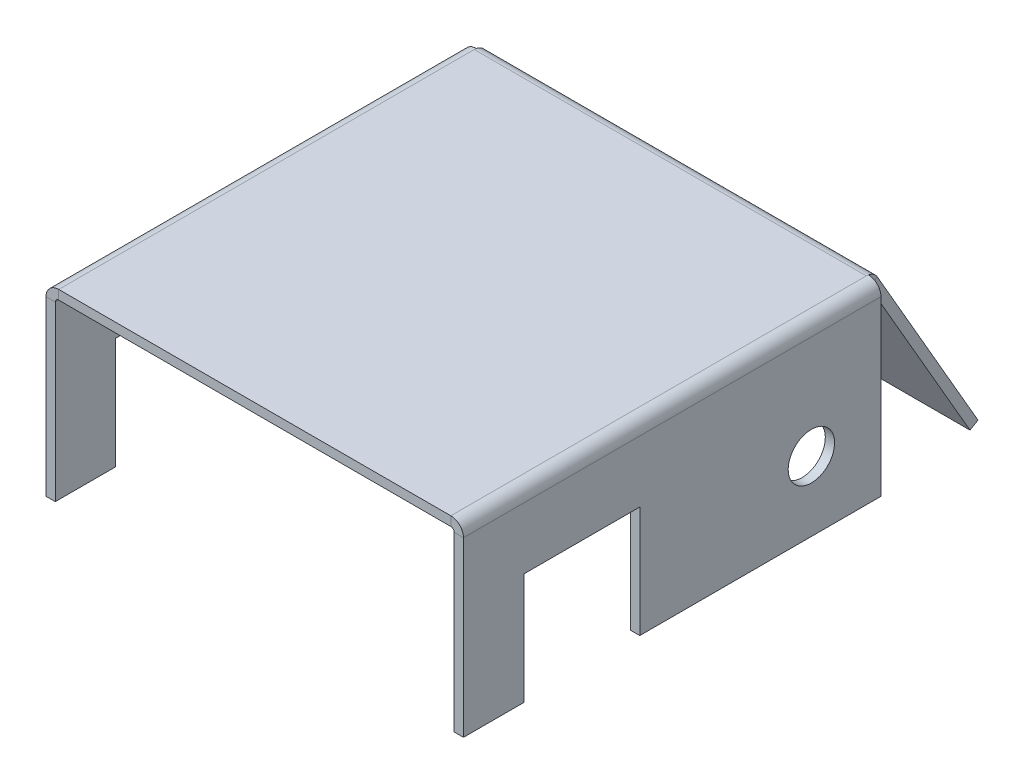
ISO-10303-21;
HEADER;
FILE_DESCRIPTION(('STEP AP214'),'2;1');
FILE_NAME('part.step','',(''),(''),'','','');
FILE_SCHEMA(('AUTOMOTIVE_DESIGN { 1 0 10303 214 1 1 1 1 }'));
ENDSEC;
DATA;
#1=APPLICATION_CONTEXT('core data for automotive mechanical design processes');
#2=APPLICATION_PROTOCOL_DEFINITION('international standard','automotive_design',2000,#1);
#3=PRODUCT_CONTEXT('',#1,'mechanical');
#4=PRODUCT('Part','Part','',(#3));
#5=PRODUCT_RELATED_PRODUCT_CATEGORY('part','',(#4));
#6=PRODUCT_DEFINITION_FORMATION('','',#4);
#7=PRODUCT_DEFINITION_CONTEXT('part definition',#1,'design');
#8=PRODUCT_DEFINITION('design','',#6,#7);
#9=PRODUCT_DEFINITION_SHAPE('','',#8);
#10=(LENGTH_UNIT() NAMED_UNIT(*) SI_UNIT(.MILLI.,.METRE.));
#11=(NAMED_UNIT(*) PLANE_ANGLE_UNIT() SI_UNIT($,.RADIAN.));
#12=(NAMED_UNIT(*) SI_UNIT($,.STERADIAN.) SOLID_ANGLE_UNIT());
#13=UNCERTAINTY_MEASURE_WITH_UNIT(LENGTH_MEASURE(1.E-05),#10,'distance_accuracy_value','');
#14=(GEOMETRIC_REPRESENTATION_CONTEXT(3) GLOBAL_UNCERTAINTY_ASSIGNED_CONTEXT((#13)) GLOBAL_UNIT_ASSIGNED_CONTEXT((#10,
#11,#12)) REPRESENTATION_CONTEXT('',''));
#15=CARTESIAN_POINT('',(0.,0.,0.));
#16=DIRECTION('',(0.,0.,1.));
#17=DIRECTION('',(1.,0.,0.));
#18=AXIS2_PLACEMENT_3D('',#15,#16,#17);
#19=CARTESIAN_POINT('',(-42.319749216301,-40.,46.974921630094));
#20=DIRECTION('',(0.,1.,0.));
#21=DIRECTION('',(-1.,0.,0.));
#22=AXIS2_PLACEMENT_3D('',#19,#20,#21);
#23=PLANE('',#22);
#24=DIRECTION('',(0.,0.,1.));
#25=VECTOR('',#24,1.);
#26=CARTESIAN_POINT('',(-42.319749216301,-40.,0.));
#27=LINE('',#26,#25);
#28=CARTESIAN_POINT('',(-42.319749216301,-40.0000000000003,33.9749216300941));
#29=VERTEX_POINT('',#28);
#30=CARTESIAN_POINT('',(-42.319749216301,-40.,46.974921630094));
#31=VERTEX_POINT('',#30);
#32=EDGE_CURVE('E276',#29,#31,#27,.T.);
#33=ORIENTED_EDGE('',*,*,#32,.F.);
#34=DIRECTION('',(1.,0.,0.));
#35=VECTOR('',#34,1.);
#36=CARTESIAN_POINT('',(-42.319749216301,-40.0000000000003,33.9749216300941));
#37=LINE('',#36,#35);
#38=CARTESIAN_POINT('',(-40.319749216301,-40.0000000000003,33.9749216300941));
#39=VERTEX_POINT('',#38);
#40=EDGE_CURVE('E259',#29,#39,#37,.T.);
#41=ORIENTED_EDGE('',*,*,#40,.T.);
#42=DIRECTION('',(0.,0.,-1.));
#43=VECTOR('',#42,1.);
#44=CARTESIAN_POINT('',(-40.319749216301,-40.,46.974921630094));
#45=LINE('',#44,#43);
#46=CARTESIAN_POINT('',(-40.319749216301,-40.,46.974921630094));
#47=VERTEX_POINT('',#46);
#48=EDGE_CURVE('E299',#39,#47,#45,.F.);
#49=ORIENTED_EDGE('',*,*,#48,.T.);
#50=DIRECTION('',(1.,0.,0.));
#51=VECTOR('',#50,1.);
#52=CARTESIAN_POINT('',(-42.319749216301,-40.,46.974921630094));
#53=LINE('',#52,#51);
#54=EDGE_CURVE('E282',#31,#47,#53,.T.);
#55=ORIENTED_EDGE('',*,*,#54,.F.);
#56=EDGE_LOOP('',(#33,#41,#49,#55));
#57=FACE_BOUND('',#56,.T.);
#58=ADVANCED_FACE('F79',(#57),#23,.F.);
#59=CARTESIAN_POINT('',(47.6802507836992,-40.,-43.0250783699059));
#60=DIRECTION('',(0.,1.,0.));
#61=DIRECTION('',(-1.,0.,0.));
#62=AXIS2_PLACEMENT_3D('',#59,#60,#61);
#63=PLANE('',#62);
#64=DIRECTION('',(0.,0.,1.));
#65=VECTOR('',#64,1.);
#66=CARTESIAN_POINT('',(45.6802507836992,-40.,-43.0250783699059));
#67=LINE('',#66,#65);
#68=CARTESIAN_POINT('',(45.6802507836992,-40.,46.974921630094));
#69=VERTEX_POINT('',#68);
#70=CARTESIAN_POINT('',(45.6802507836992,-40.,33.974921630094));
#71=VERTEX_POINT('',#70);
#72=EDGE_CURVE('E358',#69,#71,#67,.F.);
#73=ORIENTED_EDGE('',*,*,#72,.T.);
#74=DIRECTION('',(1.,0.,0.));
#75=VECTOR('',#74,1.);
#76=CARTESIAN_POINT('',(47.6802507836992,-40.,33.974921630094));
#77=LINE('',#76,#75);
#78=CARTESIAN_POINT('',(47.6802507836992,-40.,33.974921630094));
#79=VERTEX_POINT('',#78);
#80=EDGE_CURVE('E88',#71,#79,#77,.T.);
#81=ORIENTED_EDGE('',*,*,#80,.T.);
#82=DIRECTION('',(0.,0.,-1.));
#83=VECTOR('',#82,1.);
#84=CARTESIAN_POINT('',(47.6802507836992,-40.,0.));
#85=LINE('',#84,#83);
#86=CARTESIAN_POINT('',(47.6802507836992,-40.,46.974921630094));
#87=VERTEX_POINT('',#86);
#88=EDGE_CURVE('E355',#87,#79,#85,.T.);
#89=ORIENTED_EDGE('',*,*,#88,.F.);
#90=DIRECTION('',(-1.,0.,0.));
#91=VECTOR('',#90,1.);
#92=CARTESIAN_POINT('',(47.6802507836992,-40.,46.974921630094));
#93=LINE('',#92,#91);
#94=EDGE_CURVE('E415',#87,#69,#93,.T.);
#95=ORIENTED_EDGE('',*,*,#94,.T.);
#96=EDGE_LOOP('',(#73,#81,#89,#95));
#97=FACE_BOUND('',#96,.T.);
#98=ADVANCED_FACE('F353',(#97),#63,.F.);
#99=CARTESIAN_POINT('',(44.9436507836991,-2.00000000000001,-43.0250783699059));
#100=DIRECTION('',(-1.,0.,0.));
#101=DIRECTION('',(0.,0.,1.));
#102=AXIS2_PLACEMENT_3D('',#99,#100,#101);
#103=PLANE('',#102);
#104=DIRECTION('',(0.,1.,0.));
#105=VECTOR('',#104,1.);
#106=CARTESIAN_POINT('',(44.9436507836991,-2.00000000000001,-43.0250783699059));
#107=LINE('',#106,#105);
#108=CARTESIAN_POINT('',(44.9436507836991,-0.0332465812500848,-43.025078369906));
#109=VERTEX_POINT('',#108);
#110=CARTESIAN_POINT('',(44.9436507836991,0.,-43.0250783699059));
#111=VERTEX_POINT('',#110);
#112=EDGE_CURVE('E418',#109,#111,#107,.T.);
#113=ORIENTED_EDGE('',*,*,#112,.F.);
#114=CARTESIAN_POINT('',(44.9436507836991,-2.7366,-42.5998021616208));
#115=DIRECTION('',(1.,0.,0.));
#116=DIRECTION('',(0.,1.,0.));
#117=AXIS2_PLACEMENT_3D('',#114,#115,#116);
#118=CIRCLE('',#117,2.73660000000005);
#119=CARTESIAN_POINT('',(44.9436507836991,0.,-42.5998021616208));
#120=VERTEX_POINT('',#119);
#121=EDGE_CURVE('E344',#109,#120,#118,.T.);
#122=ORIENTED_EDGE('',*,*,#121,.T.);
#123=DIRECTION('',(0.,0.,1.));
#124=VECTOR('',#123,1.);
#125=CARTESIAN_POINT('',(44.9436507836991,0.,46.974921630094));
#126=LINE('',#125,#124);
#127=EDGE_CURVE('E395',#111,#120,#126,.T.);
#128=ORIENTED_EDGE('',*,*,#127,.F.);
#129=EDGE_LOOP('',(#113,#122,#128));
#130=FACE_BOUND('',#129,.T.);
#131=ADVANCED_FACE('F634',(#130),#103,.T.);
#132=CARTESIAN_POINT('',(-39.5831492163009,-1.99999999999998,-42.5998021616208));
#133=DIRECTION('',(1.,0.,0.));
#134=DIRECTION('',(0.,0.,-1.));
#135=AXIS2_PLACEMENT_3D('',#132,#133,#134);
#136=PLANE('',#135);
#137=DIRECTION('',(0.,0.,-1.));
#138=VECTOR('',#137,1.);
#139=CARTESIAN_POINT('',(-39.5831492163009,0.,-43.0250783699059));
#140=LINE('',#139,#138);
#141=CARTESIAN_POINT('',(-39.5831492163009,0.,-43.0250783699059));
#142=VERTEX_POINT('',#141);
#143=CARTESIAN_POINT('',(-39.5831492163009,0.,-42.5998021616208));
#144=VERTEX_POINT('',#143);
#145=EDGE_CURVE('E313',#142,#144,#140,.F.);
#146=ORIENTED_EDGE('',*,*,#145,.T.);
#147=CARTESIAN_POINT('',(-39.5831492163009,-2.73660000000003,-42.5998021616208));
#148=DIRECTION('',(1.,0.,0.));
#149=DIRECTION('',(0.,1.,0.));
#150=AXIS2_PLACEMENT_3D('',#147,#148,#149);
#151=CIRCLE('',#150,2.73660000000005);
#152=CARTESIAN_POINT('',(-39.5831492163009,-0.0332465812501043,-43.0250783699059));
#153=VERTEX_POINT('',#152);
#154=EDGE_CURVE('E475',#144,#153,#151,.F.);
#155=ORIENTED_EDGE('',*,*,#154,.T.);
#156=DIRECTION('',(0.,1.,0.));
#157=VECTOR('',#156,1.);
#158=CARTESIAN_POINT('',(-39.5831492163009,-2.00000000000001,-43.0250783699059));
#159=LINE('',#158,#157);
#160=EDGE_CURVE('E319',#153,#142,#159,.T.);
#161=ORIENTED_EDGE('',*,*,#160,.T.);
#162=EDGE_LOOP('',(#146,#155,#161));
#163=FACE_BOUND('',#162,.T.);
#164=ADVANCED_FACE('F673',(#163),#136,.T.);
#165=CARTESIAN_POINT('',(0.,-2.,0.));
#166=DIRECTION('',(0.,-1.,0.));
#167=DIRECTION('',(0.,0.,-1.));
#168=AXIS2_PLACEMENT_3D('',#165,#166,#167);
#169=PLANE('',#168);
#170=DIRECTION('',(0.,0.,-1.));
#171=VECTOR('',#170,1.);
#172=CARTESIAN_POINT('',(-39.5831492163009,-2.00000000000001,-43.0250783699059));
#173=LINE('',#172,#171);
#174=CARTESIAN_POINT('',(-39.5831492163009,-1.99999999999998,-42.5998021616208));
#175=VERTEX_POINT('',#174);
#176=CARTESIAN_POINT('',(-39.5831492163009,-2.,46.9749216300941));
#177=VERTEX_POINT('',#176);
#178=EDGE_CURVE('E329',#175,#177,#173,.F.);
#179=ORIENTED_EDGE('',*,*,#178,.F.);
#180=DIRECTION('',(1.,0.,0.));
#181=VECTOR('',#180,1.);
#182=CARTESIAN_POINT('',(44.9436507836991,-1.99999999999996,-42.5998021616208));
#183=LINE('',#182,#181);
#184=CARTESIAN_POINT('',(44.9436507836991,-1.99999999999996,-42.5998021616208));
#185=VERTEX_POINT('',#184);
#186=EDGE_CURVE('E460',#185,#175,#183,.F.);
#187=ORIENTED_EDGE('',*,*,#186,.F.);
#188=DIRECTION('',(0.,0.,1.));
#189=VECTOR('',#188,1.);
#190=CARTESIAN_POINT('',(44.9436507836991,-2.00000000000001,46.974921630094));
#191=LINE('',#190,#189);
#192=CARTESIAN_POINT('',(44.9436507836991,-2.00000000000001,46.974921630094));
#193=VERTEX_POINT('',#192);
#194=EDGE_CURVE('E409',#193,#185,#191,.F.);
#195=ORIENTED_EDGE('',*,*,#194,.F.);
#196=DIRECTION('',(1.,0.,0.));
#197=VECTOR('',#196,1.);
#198=CARTESIAN_POINT('',(47.6802507836991,-2.,46.9749216300941));
#199=LINE('',#198,#197);
#200=EDGE_CURVE('E341',#177,#193,#199,.T.);
#201=ORIENTED_EDGE('',*,*,#200,.F.);
#202=EDGE_LOOP('',(#179,#187,#195,#201));
#203=FACE_BOUND('',#202,.T.);
#204=ADVANCED_FACE('F575',(#203),#169,.T.);
#205=CARTESIAN_POINT('',(0.,0.,0.));
#206=DIRECTION('',(0.,-1.,0.));
#207=DIRECTION('',(0.,0.,-1.));
#208=AXIS2_PLACEMENT_3D('',#205,#206,#207);
#209=PLANE('',#208);
#210=DIRECTION('',(1.,0.,0.));
#211=VECTOR('',#210,1.);
#212=CARTESIAN_POINT('',(44.9436507836991,0.,-42.5998021616208));
#213=LINE('',#212,#211);
#214=EDGE_CURVE('E463',#120,#144,#213,.F.);
#215=ORIENTED_EDGE('',*,*,#214,.T.);
#216=CARTESIAN_POINT('',(-39.5831492163009,0.,46.9749216300941));
#217=VERTEX_POINT('',#216);
#218=EDGE_CURVE('E316',#144,#217,#140,.F.);
#219=ORIENTED_EDGE('',*,*,#218,.T.);
#220=DIRECTION('',(1.,0.,0.));
#221=VECTOR('',#220,1.);
#222=CARTESIAN_POINT('',(47.6802507836991,0.,46.9749216300941));
#223=LINE('',#222,#221);
#224=CARTESIAN_POINT('',(44.9436507836991,0.,46.974921630094));
#225=VERTEX_POINT('',#224);
#226=EDGE_CURVE('E337',#217,#225,#223,.T.);
#227=ORIENTED_EDGE('',*,*,#226,.T.);
#228=DIRECTION('',(0.,0.,1.));
#229=VECTOR('',#228,1.);
#230=CARTESIAN_POINT('',(44.9436507836991,0.,46.974921630094));
#231=LINE('',#230,#229);
#232=EDGE_CURVE('E396',#225,#120,#231,.F.);
#233=ORIENTED_EDGE('',*,*,#232,.T.);
#234=EDGE_LOOP('',(#215,#219,#227,#233));
#235=FACE_BOUND('',#234,.T.);
#236=ADVANCED_FACE('F672',(#235),#209,.F.);
#237=CARTESIAN_POINT('',(47.6802507836991,-2.,46.9749216300941));
#238=DIRECTION('',(0.,0.,1.));
#239=DIRECTION('',(1.,0.,0.));
#240=AXIS2_PLACEMENT_3D('',#237,#238,#239);
#241=PLANE('',#240);
#242=ORIENTED_EDGE('',*,*,#200,.T.);
#243=DIRECTION('',(0.,1.,0.));
#244=VECTOR('',#243,1.);
#245=CARTESIAN_POINT('',(44.9436507836991,-2.00000000000001,46.974921630094));
#246=LINE('',#245,#244);
#247=EDGE_CURVE('E403',#193,#225,#246,.T.);
#248=ORIENTED_EDGE('',*,*,#247,.T.);
#249=ORIENTED_EDGE('',*,*,#226,.F.);
#250=DIRECTION('',(0.,1.,0.));
#251=VECTOR('',#250,1.);
#252=CARTESIAN_POINT('',(-39.5831492163009,-2.00000000000001,46.974921630094));
#253=LINE('',#252,#251);
#254=EDGE_CURVE('E334',#177,#217,#253,.T.);
#255=ORIENTED_EDGE('',*,*,#254,.F.);
#256=EDGE_LOOP('',(#242,#248,#249,#255));
#257=FACE_BOUND('',#256,.T.);
#258=ADVANCED_FACE('F81',(#257),#241,.T.);
#259=CARTESIAN_POINT('',(-39.5831492163009,-2.7366,46.974921630094));
#260=DIRECTION('',(0.,0.,1.));
#261=DIRECTION('',(1.,0.,0.));
#262=AXIS2_PLACEMENT_3D('',#259,#260,#261);
#263=PLANE('',#262);
#264=DIRECTION('',(1.,0.,0.));
#265=VECTOR('',#264,1.);
#266=CARTESIAN_POINT('',(-42.3197492163009,-2.73659999999999,46.974921630094));
#267=LINE('',#266,#265);
#268=CARTESIAN_POINT('',(-40.3197492163009,-2.7366,46.974921630094));
#269=VERTEX_POINT('',#268);
#270=CARTESIAN_POINT('',(-42.3197492163009,-2.73659999999999,46.974921630094));
#271=VERTEX_POINT('',#270);
#272=EDGE_CURVE('E309',#269,#271,#267,.F.);
#273=ORIENTED_EDGE('',*,*,#272,.F.);
#274=CARTESIAN_POINT('',(-39.5831492163009,-2.7366,46.974921630094));
#275=DIRECTION('',(0.,0.,-1.));
#276=DIRECTION('',(-1.,0.,0.));
#277=AXIS2_PLACEMENT_3D('',#274,#275,#276);
#278=CIRCLE('',#277,0.73659999999999);
#279=EDGE_CURVE('E323',#177,#269,#278,.F.);
#280=ORIENTED_EDGE('',*,*,#279,.F.);
#281=ORIENTED_EDGE('',*,*,#254,.T.);
#282=CARTESIAN_POINT('',(-39.5831492163009,-2.7366,46.974921630094));
#283=DIRECTION('',(0.,0.,-1.));
#284=DIRECTION('',(-1.,0.,0.));
#285=AXIS2_PLACEMENT_3D('',#282,#283,#284);
#286=CIRCLE('',#285,2.73659999999999);
#287=EDGE_CURVE('E315',#217,#271,#286,.F.);
#288=ORIENTED_EDGE('',*,*,#287,.T.);
#289=EDGE_LOOP('',(#273,#280,#281,#288));
#290=FACE_BOUND('',#289,.T.);
#291=ADVANCED_FACE('F429',(#290),#263,.T.);
#292=CARTESIAN_POINT('',(-39.5831492163009,-2.7366,-43.0250783699059));
#293=DIRECTION('',(0.,0.,1.));
#294=DIRECTION('',(1.,0.,0.));
#295=AXIS2_PLACEMENT_3D('',#292,#293,#294);
#296=PLANE('',#295);
#297=CARTESIAN_POINT('',(-39.5831492163009,-2.7366,-43.0250783699059));
#298=DIRECTION('',(0.,0.,-1.));
#299=DIRECTION('',(-1.,0.,0.));
#300=AXIS2_PLACEMENT_3D('',#297,#298,#299);
#301=CIRCLE('',#300,0.73659999999999);
#302=CARTESIAN_POINT('',(-40.3197492163009,-2.7366,-43.0250783699059));
#303=VERTEX_POINT('',#302);
#304=CARTESIAN_POINT('',(-39.5831492163009,-2.,-43.0250783699059));
#305=VERTEX_POINT('',#304);
#306=EDGE_CURVE('E330',#303,#305,#301,.T.);
#307=ORIENTED_EDGE('',*,*,#306,.F.);
#308=DIRECTION('',(1.,0.,0.));
#309=VECTOR('',#308,1.);
#310=CARTESIAN_POINT('',(-40.3197492163009,-2.7366,-43.0250783699059));
#311=LINE('',#310,#309);
#312=CARTESIAN_POINT('',(-42.3197492163009,-2.73659999999999,-43.0250783699059));
#313=VERTEX_POINT('',#312);
#314=EDGE_CURVE('E304',#303,#313,#311,.F.);
#315=ORIENTED_EDGE('',*,*,#314,.T.);
#316=CARTESIAN_POINT('',(-39.5831492163009,-2.7366,-43.0250783699059));
#317=DIRECTION('',(0.,0.,-1.));
#318=DIRECTION('',(-1.,0.,0.));
#319=AXIS2_PLACEMENT_3D('',#316,#317,#318);
#320=CIRCLE('',#319,2.73659999999999);
#321=EDGE_CURVE('E320',#313,#142,#320,.T.);
#322=ORIENTED_EDGE('',*,*,#321,.T.);
#323=ORIENTED_EDGE('',*,*,#160,.F.);
#324=EDGE_CURVE('E338',#305,#153,#159,.T.);
#325=ORIENTED_EDGE('',*,*,#324,.F.);
#326=EDGE_LOOP('',(#307,#315,#322,#323,#325));
#327=FACE_BOUND('',#326,.T.);
#328=ADVANCED_FACE('F446',(#327),#296,.F.);
#329=CARTESIAN_POINT('',(-39.5831492163009,-2.7366,-43.0250783699059));
#330=DIRECTION('',(0.,0.,-1.));
#331=DIRECTION('',(-1.,0.,0.));
#332=AXIS2_PLACEMENT_3D('',#329,#330,#331);
#333=CYLINDRICAL_SURFACE('',#332,2.73659999999999);
#334=ORIENTED_EDGE('',*,*,#145,.F.);
#335=ORIENTED_EDGE('',*,*,#321,.F.);
#336=DIRECTION('',(0.,0.,-1.));
#337=VECTOR('',#336,1.);
#338=CARTESIAN_POINT('',(-42.3197492163009,-2.73659999999999,46.974921630094));
#339=LINE('',#338,#337);
#340=EDGE_CURVE('E302',#313,#271,#339,.F.);
#341=ORIENTED_EDGE('',*,*,#340,.T.);
#342=ORIENTED_EDGE('',*,*,#287,.F.);
#343=ORIENTED_EDGE('',*,*,#218,.F.);
#344=EDGE_LOOP('',(#334,#335,#341,#342,#343));
#345=FACE_BOUND('',#344,.T.);
#346=ADVANCED_FACE('F661',(#345),#333,.T.);
#347=CARTESIAN_POINT('',(-39.5831492163009,-2.7366,-43.0250783699059));
#348=DIRECTION('',(0.,0.,-1.));
#349=DIRECTION('',(-1.,0.,0.));
#350=AXIS2_PLACEMENT_3D('',#347,#348,#349);
#351=CYLINDRICAL_SURFACE('',#350,0.73659999999999);
#352=EDGE_CURVE('E326',#305,#175,#173,.F.);
#353=ORIENTED_EDGE('',*,*,#352,.T.);
#354=ORIENTED_EDGE('',*,*,#178,.T.);
#355=ORIENTED_EDGE('',*,*,#279,.T.);
#356=DIRECTION('',(0.,0.,-1.));
#357=VECTOR('',#356,1.);
#358=CARTESIAN_POINT('',(-40.3197492163009,-2.7366,46.974921630094));
#359=LINE('',#358,#357);
#360=EDGE_CURVE('E307',#269,#303,#359,.T.);
#361=ORIENTED_EDGE('',*,*,#360,.T.);
#362=ORIENTED_EDGE('',*,*,#306,.T.);
#363=EDGE_LOOP('',(#353,#354,#355,#361,#362));
#364=FACE_BOUND('',#363,.T.);
#365=ADVANCED_FACE('F433',(#364),#351,.F.);
#366=CARTESIAN_POINT('',(-42.319749216301,-40.,-43.0250783699059));
#367=DIRECTION('',(0.,0.,1.));
#368=DIRECTION('',(1.,0.,0.));
#369=AXIS2_PLACEMENT_3D('',#366,#367,#368);
#370=PLANE('',#369);
#371=ORIENTED_EDGE('',*,*,#314,.F.);
#372=DIRECTION('',(0.,1.,0.));
#373=VECTOR('',#372,1.);
#374=CARTESIAN_POINT('',(-40.319749216301,-40.,-43.0250783699059));
#375=LINE('',#374,#373);
#376=CARTESIAN_POINT('',(-40.319749216301,-40.,-43.0250783699059));
#377=VERTEX_POINT('',#376);
#378=EDGE_CURVE('E300',#303,#377,#375,.F.);
#379=ORIENTED_EDGE('',*,*,#378,.T.);
#380=DIRECTION('',(1.,0.,0.));
#381=VECTOR('',#380,1.);
#382=CARTESIAN_POINT('',(-42.319749216301,-40.,-43.0250783699059));
#383=LINE('',#382,#381);
#384=CARTESIAN_POINT('',(-42.319749216301,-40.,-43.0250783699059));
#385=VERTEX_POINT('',#384);
#386=EDGE_CURVE('E333',#385,#377,#383,.T.);
#387=ORIENTED_EDGE('',*,*,#386,.F.);
#388=DIRECTION('',(0.,-1.,0.));
#389=VECTOR('',#388,1.);
#390=CARTESIAN_POINT('',(-42.3197492163009,1.53809087603623E-13,-43.0250783699059));
#391=LINE('',#390,#389);
#392=EDGE_CURVE('E285',#313,#385,#391,.T.);
#393=ORIENTED_EDGE('',*,*,#392,.F.);
#394=EDGE_LOOP('',(#371,#379,#387,#393));
#395=FACE_BOUND('',#394,.T.);
#396=ADVANCED_FACE('F444',(#395),#370,.F.);
#397=CARTESIAN_POINT('',(-42.3197492163009,-1.99999999999999,46.974921630094));
#398=DIRECTION('',(0.,0.,-1.));
#399=DIRECTION('',(-1.,0.,0.));
#400=AXIS2_PLACEMENT_3D('',#397,#398,#399);
#401=PLANE('',#400);
#402=ORIENTED_EDGE('',*,*,#272,.T.);
#403=DIRECTION('',(0.,1.,0.));
#404=VECTOR('',#403,1.);
#405=CARTESIAN_POINT('',(-42.3197492163009,1.53809087603623E-13,46.974921630094));
#406=LINE('',#405,#404);
#407=EDGE_CURVE('E288',#31,#271,#406,.T.);
#408=ORIENTED_EDGE('',*,*,#407,.F.);
#409=ORIENTED_EDGE('',*,*,#54,.T.);
#410=DIRECTION('',(0.,-1.,0.));
#411=VECTOR('',#410,1.);
#412=CARTESIAN_POINT('',(-40.3197492163009,-2.,46.974921630094));
#413=LINE('',#412,#411);
#414=EDGE_CURVE('E289',#47,#269,#413,.F.);
#415=ORIENTED_EDGE('',*,*,#414,.T.);
#416=EDGE_LOOP('',(#402,#408,#409,#415));
#417=FACE_BOUND('',#416,.T.);
#418=ADVANCED_FACE('F426',(#417),#401,.F.);
#419=CARTESIAN_POINT('',(-42.3197492163009,1.53809087603623E-13,0.));
#420=DIRECTION('',(1.,0.,0.));
#421=DIRECTION('',(0.,1.,0.));
#422=AXIS2_PLACEMENT_3D('',#419,#420,#421);
#423=PLANE('',#422);
#424=CARTESIAN_POINT('',(-42.319749216301,-25.,-28.0250783699059));
#425=DIRECTION('',(-1.,0.,0.));
#426=DIRECTION('',(0.,-1.,0.));
#427=AXIS2_PLACEMENT_3D('',#424,#425,#426);
#428=CIRCLE('',#427,5.);
#429=CARTESIAN_POINT('',(-42.319749216301,-30.,-28.0250783699059));
#430=VERTEX_POINT('',#429);
#431=EDGE_CURVE('E606',#430,#430,#428,.T.);
#432=ORIENTED_EDGE('',*,*,#431,.F.);
#433=EDGE_LOOP('',(#432));
#434=FACE_BOUND('',#433,.T.);
#435=DIRECTION('',(0.,0.,1.));
#436=VECTOR('',#435,1.);
#437=CARTESIAN_POINT('',(-42.3197492163011,-16.0000000000003,33.9749216300941));
#438=LINE('',#437,#436);
#439=CARTESIAN_POINT('',(-42.3197492163011,-16.0000000000003,8.97492163009406));
#440=VERTEX_POINT('',#439);
#441=CARTESIAN_POINT('',(-42.3197492163011,-16.0000000000003,33.9749216300941));
#442=VERTEX_POINT('',#441);
#443=EDGE_CURVE('E271',#440,#442,#438,.T.);
#444=ORIENTED_EDGE('',*,*,#443,.T.);
#445=DIRECTION('',(0.,-1.,0.));
#446=VECTOR('',#445,1.);
#447=CARTESIAN_POINT('',(-42.3197492163011,-16.0000000000003,33.9749216300941));
#448=LINE('',#447,#446);
#449=EDGE_CURVE('E263',#442,#29,#448,.T.);
#450=ORIENTED_EDGE('',*,*,#449,.T.);
#451=ORIENTED_EDGE('',*,*,#32,.T.);
#452=ORIENTED_EDGE('',*,*,#407,.T.);
#453=ORIENTED_EDGE('',*,*,#340,.F.);
#454=ORIENTED_EDGE('',*,*,#392,.T.);
#455=CARTESIAN_POINT('',(-42.319749216301,-40.,8.97492163009406));
#456=VERTEX_POINT('',#455);
#457=EDGE_CURVE('E284',#385,#456,#27,.T.);
#458=ORIENTED_EDGE('',*,*,#457,.T.);
#459=DIRECTION('',(0.,1.,0.));
#460=VECTOR('',#459,1.);
#461=CARTESIAN_POINT('',(-42.3197492163011,-16.0000000000003,8.97492163009406));
#462=LINE('',#461,#460);
#463=EDGE_CURVE('E95',#456,#440,#462,.T.);
#464=ORIENTED_EDGE('',*,*,#463,.T.);
#465=EDGE_LOOP('',(#444,#450,#451,#452,#453,#454,#458,#464));
#466=FACE_BOUND('',#465,.T.);
#467=ADVANCED_FACE('F274',(#434,#466),#423,.F.);
#468=CARTESIAN_POINT('',(-40.3197492163009,1.46826124925936E-13,0.));
#469=DIRECTION('',(1.,0.,0.));
#470=DIRECTION('',(0.,1.,0.));
#471=AXIS2_PLACEMENT_3D('',#468,#469,#470);
#472=PLANE('',#471);
#473=CARTESIAN_POINT('',(-40.319749216301,-25.,-28.0250783699059));
#474=DIRECTION('',(1.,0.,0.));
#475=DIRECTION('',(0.,1.,0.));
#476=AXIS2_PLACEMENT_3D('',#473,#474,#475);
#477=CIRCLE('',#476,5.);
#478=CARTESIAN_POINT('',(-40.319749216301,-20.,-28.0250783699059));
#479=VERTEX_POINT('',#478);
#480=EDGE_CURVE('E600',#479,#479,#477,.T.);
#481=ORIENTED_EDGE('',*,*,#480,.F.);
#482=EDGE_LOOP('',(#481));
#483=FACE_BOUND('',#482,.T.);
#484=DIRECTION('',(0.,-1.,0.));
#485=VECTOR('',#484,1.);
#486=CARTESIAN_POINT('',(-40.3197492163009,1.46826124925936E-13,33.9749216300941));
#487=LINE('',#486,#485);
#488=CARTESIAN_POINT('',(-40.3197492163009,-16.0000000000003,33.9749216300941));
#489=VERTEX_POINT('',#488);
#490=EDGE_CURVE('E266',#489,#39,#487,.T.);
#491=ORIENTED_EDGE('',*,*,#490,.F.);
#492=DIRECTION('',(0.,0.,1.));
#493=VECTOR('',#492,1.);
#494=CARTESIAN_POINT('',(-40.3197492163009,-16.0000000000003,0.));
#495=LINE('',#494,#493);
#496=CARTESIAN_POINT('',(-40.319749216301,-16.0000000000003,8.97492163009406));
#497=VERTEX_POINT('',#496);
#498=EDGE_CURVE('E506',#497,#489,#495,.T.);
#499=ORIENTED_EDGE('',*,*,#498,.F.);
#500=DIRECTION('',(0.,1.,0.));
#501=VECTOR('',#500,1.);
#502=CARTESIAN_POINT('',(-40.3197492163009,1.45528707655372E-13,8.97492163009406));
#503=LINE('',#502,#501);
#504=CARTESIAN_POINT('',(-40.319749216301,-40.0000000000003,8.97492163009406));
#505=VERTEX_POINT('',#504);
#506=EDGE_CURVE('E504',#505,#497,#503,.T.);
#507=ORIENTED_EDGE('',*,*,#506,.F.);
#508=EDGE_CURVE('E296',#377,#505,#45,.F.);
#509=ORIENTED_EDGE('',*,*,#508,.F.);
#510=ORIENTED_EDGE('',*,*,#378,.F.);
#511=ORIENTED_EDGE('',*,*,#360,.F.);
#512=ORIENTED_EDGE('',*,*,#414,.F.);
#513=ORIENTED_EDGE('',*,*,#48,.F.);
#514=EDGE_LOOP('',(#491,#499,#507,#509,#510,#511,#512,#513));
#515=FACE_BOUND('',#514,.T.);
#516=ADVANCED_FACE('F438',(#483,#515),#472,.T.);
#517=ORIENTED_EDGE('',*,*,#508,.T.);
#518=DIRECTION('',(1.,0.,0.));
#519=VECTOR('',#518,1.);
#520=CARTESIAN_POINT('',(-42.319749216301,-40.0000000000003,8.97492163009406));
#521=LINE('',#520,#519);
#522=EDGE_CURVE('E270',#456,#505,#521,.T.);
#523=ORIENTED_EDGE('',*,*,#522,.F.);
#524=ORIENTED_EDGE('',*,*,#457,.F.);
#525=ORIENTED_EDGE('',*,*,#386,.T.);
#526=EDGE_LOOP('',(#517,#523,#524,#525));
#527=FACE_BOUND('',#526,.T.);
#528=ADVANCED_FACE('F630',(#527),#23,.F.);
#529=CARTESIAN_POINT('',(44.9436507836991,-2.7366,-43.0250783699059));
#530=DIRECTION('',(0.,0.,-1.));
#531=DIRECTION('',(-1.,0.,0.));
#532=AXIS2_PLACEMENT_3D('',#529,#530,#531);
#533=PLANE('',#532);
#534=DIRECTION('',(-1.,0.,0.));
#535=VECTOR('',#534,1.);
#536=CARTESIAN_POINT('',(47.6802507836991,-2.73659999999999,-43.0250783699059));
#537=LINE('',#536,#535);
#538=CARTESIAN_POINT('',(45.6802507836991,-2.7366,-43.0250783699059));
#539=VERTEX_POINT('',#538);
#540=CARTESIAN_POINT('',(47.6802507836991,-2.73659999999999,-43.0250783699059));
#541=VERTEX_POINT('',#540);
#542=EDGE_CURVE('E392',#539,#541,#537,.F.);
#543=ORIENTED_EDGE('',*,*,#542,.F.);
#544=CARTESIAN_POINT('',(44.9436507836991,-2.7366,-43.0250783699059));
#545=DIRECTION('',(0.,0.,1.));
#546=DIRECTION('',(1.,0.,0.));
#547=AXIS2_PLACEMENT_3D('',#544,#545,#546);
#548=CIRCLE('',#547,0.73659999999999);
#549=CARTESIAN_POINT('',(44.9436507836991,-2.00000000000001,-43.0250783699059));
#550=VERTEX_POINT('',#549);
#551=EDGE_CURVE('E406',#550,#539,#548,.F.);
#552=ORIENTED_EDGE('',*,*,#551,.F.);
#553=EDGE_CURVE('E312',#550,#109,#107,.T.);
#554=ORIENTED_EDGE('',*,*,#553,.T.);
#555=ORIENTED_EDGE('',*,*,#112,.T.);
#556=CARTESIAN_POINT('',(44.9436507836991,-2.7366,-43.0250783699059));
#557=DIRECTION('',(0.,0.,1.));
#558=DIRECTION('',(1.,0.,0.));
#559=AXIS2_PLACEMENT_3D('',#556,#557,#558);
#560=CIRCLE('',#559,2.73659999999999);
#561=EDGE_CURVE('E399',#111,#541,#560,.F.);
#562=ORIENTED_EDGE('',*,*,#561,.T.);
#563=EDGE_LOOP('',(#543,#552,#554,#555,#562));
#564=FACE_BOUND('',#563,.T.);
#565=ADVANCED_FACE('F578',(#564),#533,.T.);
#566=CARTESIAN_POINT('',(44.9436507836991,-2.7366,46.974921630094));
#567=DIRECTION('',(0.,0.,-1.));
#568=DIRECTION('',(-1.,0.,0.));
#569=AXIS2_PLACEMENT_3D('',#566,#567,#568);
#570=PLANE('',#569);
#571=CARTESIAN_POINT('',(44.9436507836991,-2.7366,46.974921630094));
#572=DIRECTION('',(0.,0.,1.));
#573=DIRECTION('',(1.,0.,0.));
#574=AXIS2_PLACEMENT_3D('',#571,#572,#573);
#575=CIRCLE('',#574,0.73659999999999);
#576=CARTESIAN_POINT('',(45.6802507836991,-2.7366,46.974921630094));
#577=VERTEX_POINT('',#576);
#578=EDGE_CURVE('E412',#577,#193,#575,.T.);
#579=ORIENTED_EDGE('',*,*,#578,.F.);
#580=DIRECTION('',(-1.,0.,0.));
#581=VECTOR('',#580,1.);
#582=CARTESIAN_POINT('',(45.6802507836991,-2.7366,46.974921630094));
#583=LINE('',#582,#581);
#584=CARTESIAN_POINT('',(47.6802507836991,-2.73659999999999,46.974921630094));
#585=VERTEX_POINT('',#584);
#586=EDGE_CURVE('E387',#577,#585,#583,.F.);
#587=ORIENTED_EDGE('',*,*,#586,.T.);
#588=CARTESIAN_POINT('',(44.9436507836991,-2.7366,46.974921630094));
#589=DIRECTION('',(0.,0.,1.));
#590=DIRECTION('',(1.,0.,0.));
#591=AXIS2_PLACEMENT_3D('',#588,#589,#590);
#592=CIRCLE('',#591,2.73659999999999);
#593=EDGE_CURVE('E400',#585,#225,#592,.T.);
#594=ORIENTED_EDGE('',*,*,#593,.T.);
#595=ORIENTED_EDGE('',*,*,#247,.F.);
#596=EDGE_LOOP('',(#579,#587,#594,#595));
#597=FACE_BOUND('',#596,.T.);
#598=ADVANCED_FACE('F498',(#597),#570,.F.);
#599=CARTESIAN_POINT('',(44.9436507836991,-2.7366,46.974921630094));
#600=DIRECTION('',(0.,0.,1.));
#601=DIRECTION('',(1.,0.,0.));
#602=AXIS2_PLACEMENT_3D('',#599,#600,#601);
#603=CYLINDRICAL_SURFACE('',#602,2.73659999999999);
#604=ORIENTED_EDGE('',*,*,#232,.F.);
#605=ORIENTED_EDGE('',*,*,#593,.F.);
#606=DIRECTION('',(0.,0.,1.));
#607=VECTOR('',#606,1.);
#608=CARTESIAN_POINT('',(47.6802507836991,-2.73659999999999,-43.0250783699059));
#609=LINE('',#608,#607);
#610=EDGE_CURVE('E385',#585,#541,#609,.F.);
#611=ORIENTED_EDGE('',*,*,#610,.T.);
#612=ORIENTED_EDGE('',*,*,#561,.F.);
#613=ORIENTED_EDGE('',*,*,#127,.T.);
#614=EDGE_LOOP('',(#604,#605,#611,#612,#613));
#615=FACE_BOUND('',#614,.T.);
#616=ADVANCED_FACE('F932',(#615),#603,.T.);
#617=CARTESIAN_POINT('',(44.9436507836991,-2.7366,46.974921630094));
#618=DIRECTION('',(0.,0.,1.));
#619=DIRECTION('',(1.,0.,0.));
#620=AXIS2_PLACEMENT_3D('',#617,#618,#619);
#621=CYLINDRICAL_SURFACE('',#620,0.73659999999999);
#622=ORIENTED_EDGE('',*,*,#194,.T.);
#623=DIRECTION('',(0.,1.30529642029841E-13,1.));
#624=VECTOR('',#623,1.);
#625=CARTESIAN_POINT('',(44.9436507836991,-2.00000000000001,-43.0250783699059));
#626=LINE('',#625,#624);
#627=EDGE_CURVE('E472',#550,#185,#626,.T.);
#628=ORIENTED_EDGE('',*,*,#627,.F.);
#629=ORIENTED_EDGE('',*,*,#551,.T.);
#630=DIRECTION('',(0.,0.,1.));
#631=VECTOR('',#630,1.);
#632=CARTESIAN_POINT('',(45.6802507836991,-2.7366,-43.0250783699059));
#633=LINE('',#632,#631);
#634=EDGE_CURVE('E390',#539,#577,#633,.T.);
#635=ORIENTED_EDGE('',*,*,#634,.T.);
#636=ORIENTED_EDGE('',*,*,#578,.T.);
#637=EDGE_LOOP('',(#622,#628,#629,#635,#636));
#638=FACE_BOUND('',#637,.T.);
#639=ADVANCED_FACE('F493',(#638),#621,.F.);
#640=CARTESIAN_POINT('',(47.6802507836992,-40.,46.974921630094));
#641=DIRECTION('',(0.,0.,-1.));
#642=DIRECTION('',(-1.,0.,0.));
#643=AXIS2_PLACEMENT_3D('',#640,#641,#642);
#644=PLANE('',#643);
#645=ORIENTED_EDGE('',*,*,#586,.F.);
#646=DIRECTION('',(0.,1.,0.));
#647=VECTOR('',#646,1.);
#648=CARTESIAN_POINT('',(45.6802507836992,-40.,46.974921630094));
#649=LINE('',#648,#647);
#650=EDGE_CURVE('E383',#577,#69,#649,.F.);
#651=ORIENTED_EDGE('',*,*,#650,.T.);
#652=ORIENTED_EDGE('',*,*,#94,.F.);
#653=DIRECTION('',(0.,-1.,0.));
#654=VECTOR('',#653,1.);
#655=CARTESIAN_POINT('',(47.6802507836991,1.72407063427575E-13,46.974921630094));
#656=LINE('',#655,#654);
#657=EDGE_CURVE('E368',#585,#87,#656,.T.);
#658=ORIENTED_EDGE('',*,*,#657,.F.);
#659=EDGE_LOOP('',(#645,#651,#652,#658));
#660=FACE_BOUND('',#659,.T.);
#661=ADVANCED_FACE('F500',(#660),#644,.F.);
#662=CARTESIAN_POINT('',(47.6802507836991,-1.99999999999999,-43.0250783699059));
#663=DIRECTION('',(0.,0.,1.));
#664=DIRECTION('',(1.,0.,0.));
#665=AXIS2_PLACEMENT_3D('',#662,#663,#664);
#666=PLANE('',#665);
#667=ORIENTED_EDGE('',*,*,#542,.T.);
#668=DIRECTION('',(0.,1.,0.));
#669=VECTOR('',#668,1.);
#670=CARTESIAN_POINT('',(47.6802507836991,1.72407063427575E-13,-43.0250783699059));
#671=LINE('',#670,#669);
#672=CARTESIAN_POINT('',(47.6802507836992,-40.,-43.0250783699059));
#673=VERTEX_POINT('',#672);
#674=EDGE_CURVE('E369',#673,#541,#671,.T.);
#675=ORIENTED_EDGE('',*,*,#674,.F.);
#676=DIRECTION('',(-1.,0.,0.));
#677=VECTOR('',#676,1.);
#678=CARTESIAN_POINT('',(47.6802507836992,-40.,-43.0250783699059));
#679=LINE('',#678,#677);
#680=CARTESIAN_POINT('',(45.6802507836992,-40.,-43.0250783699059));
#681=VERTEX_POINT('',#680);
#682=EDGE_CURVE('E373',#673,#681,#679,.T.);
#683=ORIENTED_EDGE('',*,*,#682,.T.);
#684=DIRECTION('',(0.,-1.,0.));
#685=VECTOR('',#684,1.);
#686=CARTESIAN_POINT('',(45.6802507836991,-2.,-43.0250783699059));
#687=LINE('',#686,#685);
#688=EDGE_CURVE('E378',#681,#539,#687,.F.);
#689=ORIENTED_EDGE('',*,*,#688,.T.);
#690=EDGE_LOOP('',(#667,#675,#683,#689));
#691=FACE_BOUND('',#690,.T.);
#692=ADVANCED_FACE('F483',(#691),#666,.F.);
#693=CARTESIAN_POINT('',(47.6802507836991,1.72407063427575E-13,0.));
#694=DIRECTION('',(-1.,0.,0.));
#695=DIRECTION('',(0.,-1.,0.));
#696=AXIS2_PLACEMENT_3D('',#693,#694,#695);
#697=PLANE('',#696);
#698=CARTESIAN_POINT('',(47.6802507836993,-25.0000000000003,-28.0250783699059));
#699=DIRECTION('',(-1.,0.,0.));
#700=DIRECTION('',(0.,-1.,0.));
#701=AXIS2_PLACEMENT_3D('',#698,#699,#700);
#702=CIRCLE('',#701,5.);
#703=CARTESIAN_POINT('',(47.6802507836993,-30.0000000000003,-28.0250783699059));
#704=VERTEX_POINT('',#703);
#705=EDGE_CURVE('E609',#704,#704,#702,.T.);
#706=ORIENTED_EDGE('',*,*,#705,.T.);
#707=EDGE_LOOP('',(#706));
#708=FACE_BOUND('',#707,.T.);
#709=ORIENTED_EDGE('',*,*,#88,.T.);
#710=DIRECTION('',(0.,-1.,0.));
#711=VECTOR('',#710,1.);
#712=CARTESIAN_POINT('',(47.6802507836992,-16.,33.974921630094));
#713=LINE('',#712,#711);
#714=CARTESIAN_POINT('',(47.6802507836992,-16.,33.974921630094));
#715=VERTEX_POINT('',#714);
#716=EDGE_CURVE('E365',#715,#79,#713,.T.);
#717=ORIENTED_EDGE('',*,*,#716,.F.);
#718=DIRECTION('',(0.,0.,1.));
#719=VECTOR('',#718,1.);
#720=CARTESIAN_POINT('',(47.6802507836992,-16.,33.974921630094));
#721=LINE('',#720,#719);
#722=CARTESIAN_POINT('',(47.6802507836992,-16.,8.97492163009405));
#723=VERTEX_POINT('',#722);
#724=EDGE_CURVE('E279',#723,#715,#721,.T.);
#725=ORIENTED_EDGE('',*,*,#724,.F.);
#726=DIRECTION('',(0.,1.,0.));
#727=VECTOR('',#726,1.);
#728=CARTESIAN_POINT('',(47.6802507836992,-16.,8.97492163009405));
#729=LINE('',#728,#727);
#730=CARTESIAN_POINT('',(47.6802507836992,-40.,8.97492163009404));
#731=VERTEX_POINT('',#730);
#732=EDGE_CURVE('E582',#731,#723,#729,.T.);
#733=ORIENTED_EDGE('',*,*,#732,.F.);
#734=EDGE_CURVE('E370',#731,#673,#85,.T.);
#735=ORIENTED_EDGE('',*,*,#734,.T.);
#736=ORIENTED_EDGE('',*,*,#674,.T.);
#737=ORIENTED_EDGE('',*,*,#610,.F.);
#738=ORIENTED_EDGE('',*,*,#657,.T.);
#739=EDGE_LOOP('',(#709,#717,#725,#733,#735,#736,#737,#738));
#740=FACE_BOUND('',#739,.T.);
#741=ADVANCED_FACE('F363',(#708,#740),#697,.F.);
#742=CARTESIAN_POINT('',(45.6802507836991,1.65424100749889E-13,0.));
#743=DIRECTION('',(-1.,0.,0.));
#744=DIRECTION('',(0.,-1.,0.));
#745=AXIS2_PLACEMENT_3D('',#742,#743,#744);
#746=PLANE('',#745);
#747=CARTESIAN_POINT('',(45.6802507836992,-25.0000000000003,-28.0250783699059));
#748=DIRECTION('',(-1.,0.,0.));
#749=DIRECTION('',(0.,-1.,0.));
#750=AXIS2_PLACEMENT_3D('',#747,#748,#749);
#751=CIRCLE('',#750,5.);
#752=CARTESIAN_POINT('',(45.6802507836992,-30.0000000000003,-28.0250783699059));
#753=VERTEX_POINT('',#752);
#754=EDGE_CURVE('E83',#753,#753,#751,.T.);
#755=ORIENTED_EDGE('',*,*,#754,.F.);
#756=EDGE_LOOP('',(#755));
#757=FACE_BOUND('',#756,.T.);
#758=DIRECTION('',(0.,1.,0.));
#759=VECTOR('',#758,1.);
#760=CARTESIAN_POINT('',(45.6802507836991,1.65424100749889E-13,33.974921630094));
#761=LINE('',#760,#759);
#762=CARTESIAN_POINT('',(45.6802507836992,-16.,33.974921630094));
#763=VERTEX_POINT('',#762);
#764=EDGE_CURVE('E502',#71,#763,#761,.T.);
#765=ORIENTED_EDGE('',*,*,#764,.F.);
#766=ORIENTED_EDGE('',*,*,#72,.F.);
#767=ORIENTED_EDGE('',*,*,#650,.F.);
#768=ORIENTED_EDGE('',*,*,#634,.F.);
#769=ORIENTED_EDGE('',*,*,#688,.F.);
#770=CARTESIAN_POINT('',(45.6802507836992,-40.,8.97492163009404));
#771=VERTEX_POINT('',#770);
#772=EDGE_CURVE('E382',#771,#681,#67,.F.);
#773=ORIENTED_EDGE('',*,*,#772,.F.);
#774=DIRECTION('',(0.,-1.,0.));
#775=VECTOR('',#774,1.);
#776=CARTESIAN_POINT('',(45.6802507836991,1.64126683479324E-13,8.97492163009405));
#777=LINE('',#776,#775);
#778=CARTESIAN_POINT('',(45.6802507836992,-16.,8.97492163009405));
#779=VERTEX_POINT('',#778);
#780=EDGE_CURVE('E103',#779,#771,#777,.T.);
#781=ORIENTED_EDGE('',*,*,#780,.F.);
#782=DIRECTION('',(0.,0.,-1.));
#783=VECTOR('',#782,1.);
#784=CARTESIAN_POINT('',(45.6802507836991,-16.,0.));
#785=LINE('',#784,#783);
#786=EDGE_CURVE('E13',#763,#779,#785,.T.);
#787=ORIENTED_EDGE('',*,*,#786,.F.);
#788=EDGE_LOOP('',(#765,#766,#767,#768,#769,#773,#781,#787));
#789=FACE_BOUND('',#788,.T.);
#790=ADVANCED_FACE('F489',(#757,#789),#746,.T.);
#791=ORIENTED_EDGE('',*,*,#734,.F.);
#792=DIRECTION('',(-1.,0.,0.));
#793=VECTOR('',#792,1.);
#794=CARTESIAN_POINT('',(47.6802507836992,-40.,8.97492163009404));
#795=LINE('',#794,#793);
#796=EDGE_CURVE('E346',#731,#771,#795,.T.);
#797=ORIENTED_EDGE('',*,*,#796,.T.);
#798=ORIENTED_EDGE('',*,*,#772,.T.);
#799=ORIENTED_EDGE('',*,*,#682,.F.);
#800=EDGE_LOOP('',(#791,#797,#798,#799));
#801=FACE_BOUND('',#800,.T.);
#802=ADVANCED_FACE('F583',(#801),#63,.F.);
#803=CARTESIAN_POINT('',(44.9436507836991,-2.7366,-42.5998021616208));
#804=DIRECTION('',(-1.,0.,0.));
#805=DIRECTION('',(0.,-1.,0.));
#806=AXIS2_PLACEMENT_3D('',#803,#804,#805);
#807=PLANE('',#806);
#808=ORIENTED_EDGE('',*,*,#553,.F.);
#809=ORIENTED_EDGE('',*,*,#627,.T.);
#810=CARTESIAN_POINT('',(44.9436507836991,-2.7366,-42.5998021616208));
#811=DIRECTION('',(1.,0.,0.));
#812=DIRECTION('',(0.,1.,0.));
#813=AXIS2_PLACEMENT_3D('',#810,#811,#812);
#814=CIRCLE('',#813,0.736600000000048);
#815=CARTESIAN_POINT('',(44.9436507836991,-2.36829999999998,-43.2377164740485));
#816=VERTEX_POINT('',#815);
#817=EDGE_CURVE('E465',#816,#185,#814,.T.);
#818=ORIENTED_EDGE('',*,*,#817,.F.);
#819=DIRECTION('',(0.,0.500000000000004,-0.866025403784436));
#820=VECTOR('',#819,1.);
#821=CARTESIAN_POINT('',(44.9436507836991,-2.36830000000002,-43.2377164740484));
#822=LINE('',#821,#820);
#823=CARTESIAN_POINT('',(44.9436507836991,-1.36830000000001,-44.9697672816173));
#824=VERTEX_POINT('',#823);
#825=EDGE_CURVE('E514',#816,#824,#822,.T.);
#826=ORIENTED_EDGE('',*,*,#825,.T.);
#827=EDGE_CURVE('E459',#824,#109,#118,.T.);
#828=ORIENTED_EDGE('',*,*,#827,.T.);
#829=EDGE_LOOP('',(#808,#809,#818,#826,#828));
#830=FACE_BOUND('',#829,.T.);
#831=ADVANCED_FACE('F572',(#830),#807,.F.);
#832=CARTESIAN_POINT('',(-39.5831492163009,-2.73660000000003,-42.5998021616208));
#833=DIRECTION('',(-1.,0.,0.));
#834=DIRECTION('',(0.,-1.,0.));
#835=AXIS2_PLACEMENT_3D('',#832,#833,#834);
#836=PLANE('',#835);
#837=ORIENTED_EDGE('',*,*,#352,.F.);
#838=ORIENTED_EDGE('',*,*,#324,.T.);
#839=CARTESIAN_POINT('',(-39.5831492163009,-1.36829999999999,-44.9697672816174));
#840=VERTEX_POINT('',#839);
#841=EDGE_CURVE('E542',#153,#840,#151,.F.);
#842=ORIENTED_EDGE('',*,*,#841,.T.);
#843=DIRECTION('',(0.,0.500000000000004,-0.866025403784436));
#844=VECTOR('',#843,1.);
#845=CARTESIAN_POINT('',(-39.5831492163009,-2.3683,-43.2377164740485));
#846=LINE('',#845,#844);
#847=CARTESIAN_POINT('',(-39.5831492163009,-2.3683,-43.2377164740485));
#848=VERTEX_POINT('',#847);
#849=EDGE_CURVE('E456',#848,#840,#846,.T.);
#850=ORIENTED_EDGE('',*,*,#849,.F.);
#851=CARTESIAN_POINT('',(-39.5831492163009,-2.73660000000003,-42.5998021616208));
#852=DIRECTION('',(1.,0.,0.));
#853=DIRECTION('',(0.,1.,0.));
#854=AXIS2_PLACEMENT_3D('',#851,#852,#853);
#855=CIRCLE('',#854,0.736600000000048);
#856=EDGE_CURVE('E454',#175,#848,#855,.F.);
#857=ORIENTED_EDGE('',*,*,#856,.F.);
#858=EDGE_LOOP('',(#837,#838,#842,#850,#857));
#859=FACE_BOUND('',#858,.T.);
#860=ADVANCED_FACE('F451',(#859),#836,.T.);
#861=CARTESIAN_POINT('',(44.9436507836991,-2.7366,-42.5998021616208));
#862=DIRECTION('',(1.,0.,0.));
#863=DIRECTION('',(0.,0.500000000000004,-0.866025403784436));
#864=AXIS2_PLACEMENT_3D('',#861,#862,#863);
#865=CYLINDRICAL_SURFACE('',#864,2.73660000000005);
#866=ORIENTED_EDGE('',*,*,#214,.F.);
#867=ORIENTED_EDGE('',*,*,#121,.F.);
#868=ORIENTED_EDGE('',*,*,#827,.F.);
#869=DIRECTION('',(1.,0.,0.));
#870=VECTOR('',#869,1.);
#871=CARTESIAN_POINT('',(0.,-1.3683,-44.9697672816173));
#872=LINE('',#871,#870);
#873=EDGE_CURVE('E517',#840,#824,#872,.T.);
#874=ORIENTED_EDGE('',*,*,#873,.F.);
#875=ORIENTED_EDGE('',*,*,#841,.F.);
#876=ORIENTED_EDGE('',*,*,#154,.F.);
#877=EDGE_LOOP('',(#866,#867,#868,#874,#875,#876));
#878=FACE_BOUND('',#877,.T.);
#879=ADVANCED_FACE('F549',(#878),#865,.T.);
#880=CARTESIAN_POINT('',(44.9436507836991,-2.7366,-42.5998021616208));
#881=DIRECTION('',(1.,0.,0.));
#882=DIRECTION('',(0.,0.500000000000004,-0.866025403784436));
#883=AXIS2_PLACEMENT_3D('',#880,#881,#882);
#884=CYLINDRICAL_SURFACE('',#883,0.736600000000048);
#885=ORIENTED_EDGE('',*,*,#186,.T.);
#886=ORIENTED_EDGE('',*,*,#856,.T.);
#887=DIRECTION('',(1.,0.,0.));
#888=VECTOR('',#887,1.);
#889=CARTESIAN_POINT('',(-39.5831492163009,-2.3683,-43.2377164740485));
#890=LINE('',#889,#888);
#891=EDGE_CURVE('E512',#848,#816,#890,.T.);
#892=ORIENTED_EDGE('',*,*,#891,.T.);
#893=ORIENTED_EDGE('',*,*,#817,.T.);
#894=EDGE_LOOP('',(#885,#886,#892,#893));
#895=FACE_BOUND('',#894,.T.);
#896=ADVANCED_FACE('F573',(#895),#884,.F.);
#897=CARTESIAN_POINT('',(44.9436507836991,-1.,-44.7571291774748));
#898=DIRECTION('',(1.,0.,0.));
#899=DIRECTION('',(0.,0.,-1.));
#900=AXIS2_PLACEMENT_3D('',#897,#898,#899);
#901=PLANE('',#900);
#902=DIRECTION('',(0.,0.866025403784436,0.500000000000004));
#903=VECTOR('',#902,1.);
#904=CARTESIAN_POINT('',(44.9436507836991,-1.,-44.7571291774748));
#905=LINE('',#904,#903);
#906=CARTESIAN_POINT('',(44.9436507836991,-38.9711431702996,-66.6797789082853));
#907=VERTEX_POINT('',#906);
#908=EDGE_CURVE('E528',#907,#824,#905,.T.);
#909=ORIENTED_EDGE('',*,*,#908,.T.);
#910=ORIENTED_EDGE('',*,*,#825,.F.);
#911=DIRECTION('',(0.,0.866025403784436,0.500000000000004));
#912=VECTOR('',#911,1.);
#913=CARTESIAN_POINT('',(44.9436507836991,-2.00000000000001,-43.0250783699059));
#914=LINE('',#913,#912);
#915=CARTESIAN_POINT('',(44.9436507836991,-39.9711431702996,-64.9477281007164));
#916=VERTEX_POINT('',#915);
#917=EDGE_CURVE('E525',#916,#816,#914,.T.);
#918=ORIENTED_EDGE('',*,*,#917,.F.);
#919=DIRECTION('',(0.,-0.500000000000004,0.866025403784436));
#920=VECTOR('',#919,1.);
#921=CARTESIAN_POINT('',(44.9436507836991,-38.9711431702996,-66.6797789082853));
#922=LINE('',#921,#920);
#923=EDGE_CURVE('E471',#907,#916,#922,.T.);
#924=ORIENTED_EDGE('',*,*,#923,.F.);
#925=EDGE_LOOP('',(#909,#910,#918,#924));
#926=FACE_BOUND('',#925,.T.);
#927=ADVANCED_FACE('F568',(#926),#901,.T.);
#928=CARTESIAN_POINT('',(-39.5831492163009,-38.9711431702996,-66.6797789082854));
#929=DIRECTION('',(-1.,0.,0.));
#930=DIRECTION('',(0.,-1.,0.));
#931=AXIS2_PLACEMENT_3D('',#928,#929,#930);
#932=PLANE('',#931);
#933=DIRECTION('',(0.,-0.866025403784436,-0.500000000000004));
#934=VECTOR('',#933,1.);
#935=CARTESIAN_POINT('',(-39.5831492163009,-39.9711431702996,-64.9477281007165));
#936=LINE('',#935,#934);
#937=CARTESIAN_POINT('',(-39.5831492163009,-39.9711431702996,-64.9477281007165));
#938=VERTEX_POINT('',#937);
#939=EDGE_CURVE('E521',#848,#938,#936,.T.);
#940=ORIENTED_EDGE('',*,*,#939,.F.);
#941=ORIENTED_EDGE('',*,*,#849,.T.);
#942=DIRECTION('',(0.,-0.866025403784436,-0.500000000000004));
#943=VECTOR('',#942,1.);
#944=CARTESIAN_POINT('',(-39.5831492163009,-38.9711431702996,-66.6797789082854));
#945=LINE('',#944,#943);
#946=CARTESIAN_POINT('',(-39.5831492163009,-38.9711431702996,-66.6797789082854));
#947=VERTEX_POINT('',#946);
#948=EDGE_CURVE('E522',#840,#947,#945,.T.);
#949=ORIENTED_EDGE('',*,*,#948,.T.);
#950=DIRECTION('',(0.,-0.500000000000004,0.866025403784436));
#951=VECTOR('',#950,1.);
#952=CARTESIAN_POINT('',(-39.5831492163009,-38.9711431702996,-66.6797789082854));
#953=LINE('',#952,#951);
#954=EDGE_CURVE('E531',#947,#938,#953,.T.);
#955=ORIENTED_EDGE('',*,*,#954,.T.);
#956=EDGE_LOOP('',(#940,#941,#949,#955));
#957=FACE_BOUND('',#956,.T.);
#958=ADVANCED_FACE('F556',(#957),#932,.T.);
#959=CARTESIAN_POINT('',(0.,19.1304054340775,-33.1348341812137));
#960=DIRECTION('',(0.,0.500000000000004,-0.866025403784436));
#961=DIRECTION('',(0.,0.866025403784436,0.500000000000004));
#962=AXIS2_PLACEMENT_3D('',#959,#960,#961);
#963=PLANE('',#962);
#964=ORIENTED_EDGE('',*,*,#948,.F.);
#965=ORIENTED_EDGE('',*,*,#873,.T.);
#966=ORIENTED_EDGE('',*,*,#908,.F.);
#967=DIRECTION('',(1.,0.,0.));
#968=VECTOR('',#967,1.);
#969=CARTESIAN_POINT('',(44.9436507836991,-38.9711431702996,-66.6797789082853));
#970=LINE('',#969,#968);
#971=EDGE_CURVE('E524',#947,#907,#970,.T.);
#972=ORIENTED_EDGE('',*,*,#971,.F.);
#973=EDGE_LOOP('',(#964,#965,#966,#972));
#974=FACE_BOUND('',#973,.T.);
#975=ADVANCED_FACE('F559',(#974),#963,.T.);
#976=CARTESIAN_POINT('',(0.,18.1304054340775,-31.4027833736448));
#977=DIRECTION('',(0.,0.500000000000004,-0.866025403784436));
#978=DIRECTION('',(0.,0.866025403784436,0.500000000000004));
#979=AXIS2_PLACEMENT_3D('',#976,#977,#978);
#980=PLANE('',#979);
#981=ORIENTED_EDGE('',*,*,#891,.F.);
#982=ORIENTED_EDGE('',*,*,#939,.T.);
#983=DIRECTION('',(1.,0.,0.));
#984=VECTOR('',#983,1.);
#985=CARTESIAN_POINT('',(44.9436507836991,-39.9711431702996,-64.9477281007164));
#986=LINE('',#985,#984);
#987=EDGE_CURVE('E533',#938,#916,#986,.T.);
#988=ORIENTED_EDGE('',*,*,#987,.T.);
#989=ORIENTED_EDGE('',*,*,#917,.T.);
#990=EDGE_LOOP('',(#981,#982,#988,#989));
#991=FACE_BOUND('',#990,.T.);
#992=ADVANCED_FACE('F565',(#991),#980,.F.);
#993=CARTESIAN_POINT('',(44.9436507836991,-38.9711431702996,-66.6797789082853));
#994=DIRECTION('',(0.,-0.866025403784436,-0.500000000000004));
#995=DIRECTION('',(0.,0.500000000000004,-0.866025403784436));
#996=AXIS2_PLACEMENT_3D('',#993,#994,#995);
#997=PLANE('',#996);
#998=ORIENTED_EDGE('',*,*,#987,.F.);
#999=ORIENTED_EDGE('',*,*,#954,.F.);
#1000=ORIENTED_EDGE('',*,*,#971,.T.);
#1001=ORIENTED_EDGE('',*,*,#923,.T.);
#1002=EDGE_LOOP('',(#998,#999,#1000,#1001));
#1003=FACE_BOUND('',#1002,.T.);
#1004=ADVANCED_FACE('F562',(#1003),#997,.T.);
#1005=CARTESIAN_POINT('',(-42.3197492163011,-16.0000000000003,8.97492163009406));
#1006=DIRECTION('',(0.,0.,-1.));
#1007=DIRECTION('',(-1.,0.,0.));
#1008=AXIS2_PLACEMENT_3D('',#1005,#1006,#1007);
#1009=PLANE('',#1008);
#1010=ORIENTED_EDGE('',*,*,#780,.T.);
#1011=ORIENTED_EDGE('',*,*,#796,.F.);
#1012=ORIENTED_EDGE('',*,*,#732,.T.);
#1013=DIRECTION('',(1.,0.,0.));
#1014=VECTOR('',#1013,1.);
#1015=CARTESIAN_POINT('',(-42.3197492163011,-16.0000000000003,8.97492163009406));
#1016=LINE('',#1015,#1014);
#1017=EDGE_CURVE('E585',#779,#723,#1016,.T.);
#1018=ORIENTED_EDGE('',*,*,#1017,.F.);
#1019=EDGE_LOOP('',(#1010,#1011,#1012,#1018));
#1020=FACE_BOUND('',#1019,.T.);
#1021=ADVANCED_FACE('F584',(#1020),#1009,.F.);
#1022=CARTESIAN_POINT('',(-42.3197492163011,-16.0000000000003,33.9749216300941));
#1023=DIRECTION('',(0.,0.,1.));
#1024=DIRECTION('',(1.,0.,0.));
#1025=AXIS2_PLACEMENT_3D('',#1022,#1023,#1024);
#1026=PLANE('',#1025);
#1027=ORIENTED_EDGE('',*,*,#764,.T.);
#1028=DIRECTION('',(1.,0.,0.));
#1029=VECTOR('',#1028,1.);
#1030=CARTESIAN_POINT('',(-42.3197492163011,-16.0000000000003,33.9749216300941));
#1031=LINE('',#1030,#1029);
#1032=EDGE_CURVE('E594',#763,#715,#1031,.T.);
#1033=ORIENTED_EDGE('',*,*,#1032,.T.);
#1034=ORIENTED_EDGE('',*,*,#716,.T.);
#1035=ORIENTED_EDGE('',*,*,#80,.F.);
#1036=EDGE_LOOP('',(#1027,#1033,#1034,#1035));
#1037=FACE_BOUND('',#1036,.T.);
#1038=ADVANCED_FACE('F599',(#1037),#1026,.F.);
#1039=CARTESIAN_POINT('',(-42.3197492163011,-16.0000000000003,33.9749216300941));
#1040=DIRECTION('',(0.,1.,0.));
#1041=DIRECTION('',(-1.,0.,0.));
#1042=AXIS2_PLACEMENT_3D('',#1039,#1040,#1041);
#1043=PLANE('',#1042);
#1044=ORIENTED_EDGE('',*,*,#786,.T.);
#1045=ORIENTED_EDGE('',*,*,#1017,.T.);
#1046=ORIENTED_EDGE('',*,*,#724,.T.);
#1047=ORIENTED_EDGE('',*,*,#1032,.F.);
#1048=EDGE_LOOP('',(#1044,#1045,#1046,#1047));
#1049=FACE_BOUND('',#1048,.T.);
#1050=ADVANCED_FACE('F598',(#1049),#1043,.F.);
#1051=ORIENTED_EDGE('',*,*,#498,.T.);
#1052=EDGE_CURVE('E592',#442,#489,#1031,.T.);
#1053=ORIENTED_EDGE('',*,*,#1052,.F.);
#1054=ORIENTED_EDGE('',*,*,#443,.F.);
#1055=EDGE_CURVE('E595',#440,#497,#1016,.T.);
#1056=ORIENTED_EDGE('',*,*,#1055,.T.);
#1057=EDGE_LOOP('',(#1051,#1053,#1054,#1056));
#1058=FACE_BOUND('',#1057,.T.);
#1059=ADVANCED_FACE('F717',(#1058),#1043,.F.);
#1060=ORIENTED_EDGE('',*,*,#490,.T.);
#1061=ORIENTED_EDGE('',*,*,#40,.F.);
#1062=ORIENTED_EDGE('',*,*,#449,.F.);
#1063=ORIENTED_EDGE('',*,*,#1052,.T.);
#1064=EDGE_LOOP('',(#1060,#1061,#1062,#1063));
#1065=FACE_BOUND('',#1064,.T.);
#1066=ADVANCED_FACE('F261',(#1065),#1026,.F.);
#1067=ORIENTED_EDGE('',*,*,#506,.T.);
#1068=ORIENTED_EDGE('',*,*,#1055,.F.);
#1069=ORIENTED_EDGE('',*,*,#463,.F.);
#1070=ORIENTED_EDGE('',*,*,#522,.T.);
#1071=EDGE_LOOP('',(#1067,#1068,#1069,#1070));
#1072=FACE_BOUND('',#1071,.T.);
#1073=ADVANCED_FACE('F714',(#1072),#1009,.F.);
#1074=CARTESIAN_POINT('',(47.6802507836993,-25.0000000000003,-28.0250783699059));
#1075=DIRECTION('',(-1.,0.,0.));
#1076=DIRECTION('',(0.,-1.,0.));
#1077=AXIS2_PLACEMENT_3D('',#1074,#1075,#1076);
#1078=CYLINDRICAL_SURFACE('',#1077,5.);
#1079=ORIENTED_EDGE('',*,*,#754,.T.);
#1080=EDGE_LOOP('',(#1079));
#1081=FACE_BOUND('',#1080,.T.);
#1082=ORIENTED_EDGE('',*,*,#705,.F.);
#1083=EDGE_LOOP('',(#1082));
#1084=FACE_BOUND('',#1083,.T.);
#1085=ADVANCED_FACE('F616',(#1081,#1084),#1078,.F.);
#1086=ORIENTED_EDGE('',*,*,#480,.T.);
#1087=EDGE_LOOP('',(#1086));
#1088=FACE_BOUND('',#1087,.T.);
#1089=ORIENTED_EDGE('',*,*,#431,.T.);
#1090=EDGE_LOOP('',(#1089));
#1091=FACE_BOUND('',#1090,.T.);
#1092=ADVANCED_FACE('F719',(#1088,#1091),#1078,.F.);
#1093=CLOSED_SHELL('',(#58,#98,#131,#164,#204,#236,#258,#291,#328,#346,#365,#396,#418,#467,#516,
#528,#565,#598,#616,#639,#661,#692,#741,#790,#802,#831,#860,#879,#896,#927,#958,#975,#992,#1004,
#1021,#1038,#1050,#1059,#1066,#1073,#1085,#1092));
#1094=MANIFOLD_SOLID_BREP('B2',#1093);
#1095=ADVANCED_BREP_SHAPE_REPRESENTATION('',(#18,#1094),#14);
#1096=SHAPE_DEFINITION_REPRESENTATION(#9,#1095);
ENDSEC;
END-ISO-10303-21;
